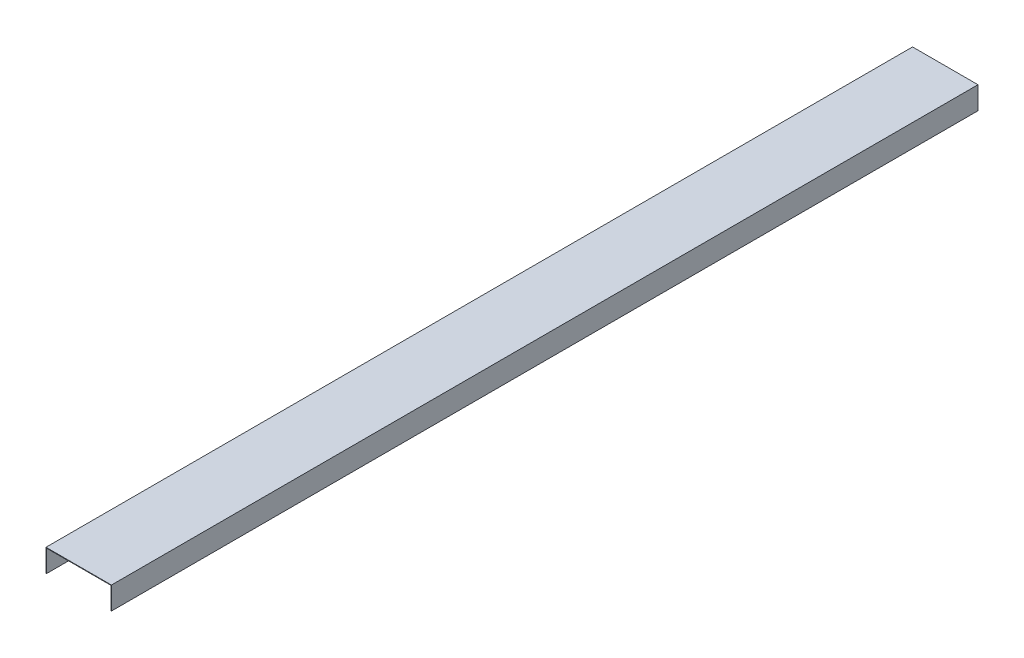
ISO-10303-21;
HEADER;
FILE_DESCRIPTION(('STEP AP214'),'2;1');
FILE_NAME('part.step','',(''),(''),'','','');
FILE_SCHEMA(('AUTOMOTIVE_DESIGN { 1 0 10303 214 1 1 1 1 }'));
ENDSEC;
DATA;
#1=APPLICATION_CONTEXT('core data for automotive mechanical design processes');
#2=APPLICATION_PROTOCOL_DEFINITION('international standard','automotive_design',2000,#1);
#3=PRODUCT_CONTEXT('',#1,'mechanical');
#4=PRODUCT('Part','Part','',(#3));
#5=PRODUCT_RELATED_PRODUCT_CATEGORY('part','',(#4));
#6=PRODUCT_DEFINITION_FORMATION('','',#4);
#7=PRODUCT_DEFINITION_CONTEXT('part definition',#1,'design');
#8=PRODUCT_DEFINITION('design','',#6,#7);
#9=PRODUCT_DEFINITION_SHAPE('','',#8);
#10=(LENGTH_UNIT() NAMED_UNIT(*) SI_UNIT(.MILLI.,.METRE.));
#11=(NAMED_UNIT(*) PLANE_ANGLE_UNIT() SI_UNIT($,.RADIAN.));
#12=(NAMED_UNIT(*) SI_UNIT($,.STERADIAN.) SOLID_ANGLE_UNIT());
#13=UNCERTAINTY_MEASURE_WITH_UNIT(LENGTH_MEASURE(1.E-05),#10,'distance_accuracy_value','');
#14=(GEOMETRIC_REPRESENTATION_CONTEXT(3) GLOBAL_UNCERTAINTY_ASSIGNED_CONTEXT((#13)) GLOBAL_UNIT_ASSIGNED_CONTEXT((#10,
#11,#12)) REPRESENTATION_CONTEXT('',''));
#15=CARTESIAN_POINT('',(0.,0.,0.));
#16=DIRECTION('',(0.,0.,1.));
#17=DIRECTION('',(1.,0.,0.));
#18=AXIS2_PLACEMENT_3D('',#15,#16,#17);
#19=CARTESIAN_POINT('',(-46.0375000000001,31.75,-609.599999999999));
#20=DIRECTION('',(0.,0.,1.));
#21=DIRECTION('',(1.,0.,0.));
#22=AXIS2_PLACEMENT_3D('',#19,#20,#21);
#23=PLANE('',#22);
#24=DIRECTION('',(0.,-1.,0.));
#25=VECTOR('',#24,1.);
#26=CARTESIAN_POINT('',(45.2755000000001,30.988,-609.600000000001));
#27=LINE('',#26,#25);
#28=CARTESIAN_POINT('',(45.2755000000001,30.988,-609.600000000001));
#29=VERTEX_POINT('',#28);
#30=CARTESIAN_POINT('',(45.2755000000001,0.,-609.600000000001));
#31=VERTEX_POINT('',#30);
#32=EDGE_CURVE('E119',#29,#31,#27,.T.);
#33=ORIENTED_EDGE('',*,*,#32,.F.);
#34=DIRECTION('',(-1.,0.,0.));
#35=VECTOR('',#34,1.);
#36=CARTESIAN_POINT('',(-45.2755000000001,30.988,-609.600000000001));
#37=LINE('',#36,#35);
#38=CARTESIAN_POINT('',(-45.2755000000001,30.988,-609.600000000001));
#39=VERTEX_POINT('',#38);
#40=EDGE_CURVE('E107',#29,#39,#37,.T.);
#41=ORIENTED_EDGE('',*,*,#40,.T.);
#42=DIRECTION('',(0.,-1.,0.));
#43=VECTOR('',#42,1.);
#44=CARTESIAN_POINT('',(-45.2755000000001,30.988,-609.600000000001));
#45=LINE('',#44,#43);
#46=CARTESIAN_POINT('',(-45.2755000000001,0.,-609.600000000001));
#47=VERTEX_POINT('',#46);
#48=EDGE_CURVE('E127',#39,#47,#45,.T.);
#49=ORIENTED_EDGE('',*,*,#48,.T.);
#50=DIRECTION('',(-1.,0.,0.));
#51=VECTOR('',#50,1.);
#52=CARTESIAN_POINT('',(-46.0375000000001,0.,-609.599999999999));
#53=LINE('',#52,#51);
#54=CARTESIAN_POINT('',(-46.0375000000001,0.,-609.599999999999));
#55=VERTEX_POINT('',#54);
#56=EDGE_CURVE('E130',#47,#55,#53,.T.);
#57=ORIENTED_EDGE('',*,*,#56,.T.);
#58=DIRECTION('',(0.,-1.,0.));
#59=VECTOR('',#58,1.);
#60=CARTESIAN_POINT('',(-46.0375000000001,31.75,-609.599999999999));
#61=LINE('',#60,#59);
#62=CARTESIAN_POINT('',(-46.0375000000001,31.75,-609.599999999999));
#63=VERTEX_POINT('',#62);
#64=EDGE_CURVE('E40',#63,#55,#61,.T.);
#65=ORIENTED_EDGE('',*,*,#64,.F.);
#66=DIRECTION('',(-1.,0.,0.));
#67=VECTOR('',#66,1.);
#68=CARTESIAN_POINT('',(-46.0375000000001,31.75,-609.599999999999));
#69=LINE('',#68,#67);
#70=CARTESIAN_POINT('',(46.0374999999999,31.75,-609.599999999999));
#71=VERTEX_POINT('',#70);
#72=EDGE_CURVE('E84',#71,#63,#69,.T.);
#73=ORIENTED_EDGE('',*,*,#72,.F.);
#74=DIRECTION('',(0.,-1.,0.));
#75=VECTOR('',#74,1.);
#76=CARTESIAN_POINT('',(46.0374999999999,31.75,-609.599999999999));
#77=LINE('',#76,#75);
#78=CARTESIAN_POINT('',(46.0374999999999,0.,-609.599999999999));
#79=VERTEX_POINT('',#78);
#80=EDGE_CURVE('E11',#71,#79,#77,.T.);
#81=ORIENTED_EDGE('',*,*,#80,.T.);
#82=EDGE_CURVE('E125',#79,#31,#53,.T.);
#83=ORIENTED_EDGE('',*,*,#82,.T.);
#84=EDGE_LOOP('',(#33,#41,#49,#57,#65,#73,#81,#83));
#85=FACE_BOUND('',#84,.T.);
#86=ADVANCED_FACE('F32',(#85),#23,.F.);
#87=CARTESIAN_POINT('',(-46.0374999999999,31.75,609.600000000001));
#88=DIRECTION('',(0.,0.,-1.));
#89=DIRECTION('',(-1.,0.,0.));
#90=AXIS2_PLACEMENT_3D('',#87,#88,#89);
#91=PLANE('',#90);
#92=DIRECTION('',(0.,-1.,0.));
#93=VECTOR('',#92,1.);
#94=CARTESIAN_POINT('',(45.2755000000001,30.988,609.600000000001));
#95=LINE('',#94,#93);
#96=CARTESIAN_POINT('',(45.2755000000001,30.988,609.600000000001));
#97=VERTEX_POINT('',#96);
#98=CARTESIAN_POINT('',(45.2755000000001,0.,609.600000000001));
#99=VERTEX_POINT('',#98);
#100=EDGE_CURVE('E121',#97,#99,#95,.T.);
#101=ORIENTED_EDGE('',*,*,#100,.T.);
#102=DIRECTION('',(1.,0.,0.));
#103=VECTOR('',#102,1.);
#104=CARTESIAN_POINT('',(-46.0374999999999,0.,609.600000000001));
#105=LINE('',#104,#103);
#106=CARTESIAN_POINT('',(46.0375000000001,0.,609.600000000001));
#107=VERTEX_POINT('',#106);
#108=EDGE_CURVE('E77',#99,#107,#105,.T.);
#109=ORIENTED_EDGE('',*,*,#108,.T.);
#110=DIRECTION('',(0.,-1.,0.));
#111=VECTOR('',#110,1.);
#112=CARTESIAN_POINT('',(46.0375000000001,31.75,609.600000000001));
#113=LINE('',#112,#111);
#114=CARTESIAN_POINT('',(46.0375000000001,31.75,609.600000000001));
#115=VERTEX_POINT('',#114);
#116=EDGE_CURVE('E141',#115,#107,#113,.T.);
#117=ORIENTED_EDGE('',*,*,#116,.F.);
#118=DIRECTION('',(1.,0.,0.));
#119=VECTOR('',#118,1.);
#120=CARTESIAN_POINT('',(-46.0374999999999,31.75,609.600000000001));
#121=LINE('',#120,#119);
#122=CARTESIAN_POINT('',(-46.0374999999999,31.75,609.600000000001));
#123=VERTEX_POINT('',#122);
#124=EDGE_CURVE('E56',#123,#115,#121,.T.);
#125=ORIENTED_EDGE('',*,*,#124,.F.);
#126=DIRECTION('',(0.,-1.,0.));
#127=VECTOR('',#126,1.);
#128=CARTESIAN_POINT('',(-46.0374999999999,31.75,609.600000000001));
#129=LINE('',#128,#127);
#130=CARTESIAN_POINT('',(-46.0374999999999,0.,609.600000000001));
#131=VERTEX_POINT('',#130);
#132=EDGE_CURVE('E149',#123,#131,#129,.T.);
#133=ORIENTED_EDGE('',*,*,#132,.T.);
#134=CARTESIAN_POINT('',(-45.2755000000001,0.,609.600000000001));
#135=VERTEX_POINT('',#134);
#136=EDGE_CURVE('E137',#131,#135,#105,.T.);
#137=ORIENTED_EDGE('',*,*,#136,.T.);
#138=DIRECTION('',(0.,-1.,0.));
#139=VECTOR('',#138,1.);
#140=CARTESIAN_POINT('',(-45.2755000000001,30.988,609.600000000001));
#141=LINE('',#140,#139);
#142=CARTESIAN_POINT('',(-45.2755000000001,30.988,609.600000000001));
#143=VERTEX_POINT('',#142);
#144=EDGE_CURVE('E47',#143,#135,#141,.T.);
#145=ORIENTED_EDGE('',*,*,#144,.F.);
#146=DIRECTION('',(1.,0.,0.));
#147=VECTOR('',#146,1.);
#148=CARTESIAN_POINT('',(-45.2755000000001,30.988,609.600000000001));
#149=LINE('',#148,#147);
#150=EDGE_CURVE('E192',#143,#97,#149,.T.);
#151=ORIENTED_EDGE('',*,*,#150,.T.);
#152=EDGE_LOOP('',(#101,#109,#117,#125,#133,#137,#145,#151));
#153=FACE_BOUND('',#152,.T.);
#154=ADVANCED_FACE('F161',(#153),#91,.F.);
#155=CARTESIAN_POINT('',(0.,0.,0.));
#156=DIRECTION('',(0.,1.,0.));
#157=DIRECTION('',(0.,0.,1.));
#158=AXIS2_PLACEMENT_3D('',#155,#156,#157);
#159=PLANE('',#158);
#160=DIRECTION('',(0.,0.,-1.));
#161=VECTOR('',#160,1.);
#162=CARTESIAN_POINT('',(45.2755000000001,0.,-609.600000000001));
#163=LINE('',#162,#161);
#164=EDGE_CURVE('E188',#99,#31,#163,.T.);
#165=ORIENTED_EDGE('',*,*,#164,.T.);
#166=ORIENTED_EDGE('',*,*,#82,.F.);
#167=DIRECTION('',(0.,0.,-1.));
#168=VECTOR('',#167,1.);
#169=CARTESIAN_POINT('',(46.0374999999999,0.,-609.599999999999));
#170=LINE('',#169,#168);
#171=EDGE_CURVE('E126',#107,#79,#170,.T.);
#172=ORIENTED_EDGE('',*,*,#171,.F.);
#173=ORIENTED_EDGE('',*,*,#108,.F.);
#174=EDGE_LOOP('',(#165,#166,#172,#173));
#175=FACE_BOUND('',#174,.T.);
#176=ADVANCED_FACE('F181',(#175),#159,.F.);
#177=DIRECTION('',(0.,0.,1.));
#178=VECTOR('',#177,1.);
#179=CARTESIAN_POINT('',(-45.2755000000001,0.,-609.600000000001));
#180=LINE('',#179,#178);
#181=EDGE_CURVE('E122',#47,#135,#180,.T.);
#182=ORIENTED_EDGE('',*,*,#181,.T.);
#183=ORIENTED_EDGE('',*,*,#136,.F.);
#184=DIRECTION('',(0.,0.,1.));
#185=VECTOR('',#184,1.);
#186=CARTESIAN_POINT('',(-46.0375000000001,0.,-609.599999999999));
#187=LINE('',#186,#185);
#188=EDGE_CURVE('E144',#55,#131,#187,.T.);
#189=ORIENTED_EDGE('',*,*,#188,.F.);
#190=ORIENTED_EDGE('',*,*,#56,.F.);
#191=EDGE_LOOP('',(#182,#183,#189,#190));
#192=FACE_BOUND('',#191,.T.);
#193=ADVANCED_FACE('F160',(#192),#159,.F.);
#194=CARTESIAN_POINT('',(46.0374999999999,31.75,-609.599999999999));
#195=DIRECTION('',(-1.,0.,0.));
#196=DIRECTION('',(0.,0.,1.));
#197=AXIS2_PLACEMENT_3D('',#194,#195,#196);
#198=PLANE('',#197);
#199=ORIENTED_EDGE('',*,*,#171,.T.);
#200=ORIENTED_EDGE('',*,*,#80,.F.);
#201=DIRECTION('',(0.,0.,-1.));
#202=VECTOR('',#201,1.);
#203=CARTESIAN_POINT('',(46.0374999999999,31.75,-609.599999999999));
#204=LINE('',#203,#202);
#205=EDGE_CURVE('E135',#115,#71,#204,.T.);
#206=ORIENTED_EDGE('',*,*,#205,.F.);
#207=ORIENTED_EDGE('',*,*,#116,.T.);
#208=EDGE_LOOP('',(#199,#200,#206,#207));
#209=FACE_BOUND('',#208,.T.);
#210=ADVANCED_FACE('F34',(#209),#198,.F.);
#211=CARTESIAN_POINT('',(-46.0375000000001,31.75,-609.599999999999));
#212=DIRECTION('',(1.,0.,0.));
#213=DIRECTION('',(0.,0.,-1.));
#214=AXIS2_PLACEMENT_3D('',#211,#212,#213);
#215=PLANE('',#214);
#216=ORIENTED_EDGE('',*,*,#188,.T.);
#217=ORIENTED_EDGE('',*,*,#132,.F.);
#218=DIRECTION('',(0.,0.,1.));
#219=VECTOR('',#218,1.);
#220=CARTESIAN_POINT('',(-46.0375000000001,31.75,-609.599999999999));
#221=LINE('',#220,#219);
#222=EDGE_CURVE('E139',#63,#123,#221,.T.);
#223=ORIENTED_EDGE('',*,*,#222,.F.);
#224=ORIENTED_EDGE('',*,*,#64,.T.);
#225=EDGE_LOOP('',(#216,#217,#223,#224));
#226=FACE_BOUND('',#225,.T.);
#227=ADVANCED_FACE('F155',(#226),#215,.F.);
#228=CARTESIAN_POINT('',(0.,31.75,0.));
#229=DIRECTION('',(0.,1.,0.));
#230=DIRECTION('',(0.,0.,1.));
#231=AXIS2_PLACEMENT_3D('',#228,#229,#230);
#232=PLANE('',#231);
#233=ORIENTED_EDGE('',*,*,#205,.T.);
#234=ORIENTED_EDGE('',*,*,#72,.T.);
#235=ORIENTED_EDGE('',*,*,#222,.T.);
#236=ORIENTED_EDGE('',*,*,#124,.T.);
#237=EDGE_LOOP('',(#233,#234,#235,#236));
#238=FACE_BOUND('',#237,.T.);
#239=ADVANCED_FACE('F166',(#238),#232,.T.);
#240=CARTESIAN_POINT('',(45.2755000000001,30.988,-609.600000000001));
#241=DIRECTION('',(-1.,0.,0.));
#242=DIRECTION('',(0.,0.,1.));
#243=AXIS2_PLACEMENT_3D('',#240,#241,#242);
#244=PLANE('',#243);
#245=ORIENTED_EDGE('',*,*,#164,.F.);
#246=ORIENTED_EDGE('',*,*,#100,.F.);
#247=DIRECTION('',(0.,0.,-1.));
#248=VECTOR('',#247,1.);
#249=CARTESIAN_POINT('',(45.2755000000001,30.988,-609.600000000001));
#250=LINE('',#249,#248);
#251=EDGE_CURVE('E111',#97,#29,#250,.T.);
#252=ORIENTED_EDGE('',*,*,#251,.T.);
#253=ORIENTED_EDGE('',*,*,#32,.T.);
#254=EDGE_LOOP('',(#245,#246,#252,#253));
#255=FACE_BOUND('',#254,.T.);
#256=ADVANCED_FACE('F118',(#255),#244,.T.);
#257=CARTESIAN_POINT('',(-45.2755000000001,30.988,-609.600000000001));
#258=DIRECTION('',(1.,0.,0.));
#259=DIRECTION('',(0.,0.,-1.));
#260=AXIS2_PLACEMENT_3D('',#257,#258,#259);
#261=PLANE('',#260);
#262=ORIENTED_EDGE('',*,*,#181,.F.);
#263=ORIENTED_EDGE('',*,*,#48,.F.);
#264=DIRECTION('',(0.,0.,1.));
#265=VECTOR('',#264,1.);
#266=CARTESIAN_POINT('',(-45.2755000000001,30.988,-609.600000000001));
#267=LINE('',#266,#265);
#268=EDGE_CURVE('E113',#39,#143,#267,.T.);
#269=ORIENTED_EDGE('',*,*,#268,.T.);
#270=ORIENTED_EDGE('',*,*,#144,.T.);
#271=EDGE_LOOP('',(#262,#263,#269,#270));
#272=FACE_BOUND('',#271,.T.);
#273=ADVANCED_FACE('F173',(#272),#261,.T.);
#274=CARTESIAN_POINT('',(0.,30.988,0.));
#275=DIRECTION('',(0.,1.,0.));
#276=DIRECTION('',(0.,0.,1.));
#277=AXIS2_PLACEMENT_3D('',#274,#275,#276);
#278=PLANE('',#277);
#279=ORIENTED_EDGE('',*,*,#251,.F.);
#280=ORIENTED_EDGE('',*,*,#150,.F.);
#281=ORIENTED_EDGE('',*,*,#268,.F.);
#282=ORIENTED_EDGE('',*,*,#40,.F.);
#283=EDGE_LOOP('',(#279,#280,#281,#282));
#284=FACE_BOUND('',#283,.T.);
#285=ADVANCED_FACE('F109',(#284),#278,.F.);
#286=CLOSED_SHELL('',(#86,#154,#176,#193,#210,#227,#239,#256,#273,#285));
#287=MANIFOLD_SOLID_BREP('B2',#286);
#288=ADVANCED_BREP_SHAPE_REPRESENTATION('',(#18,#287),#14);
#289=SHAPE_DEFINITION_REPRESENTATION(#9,#288);
ENDSEC;
END-ISO-10303-21;
